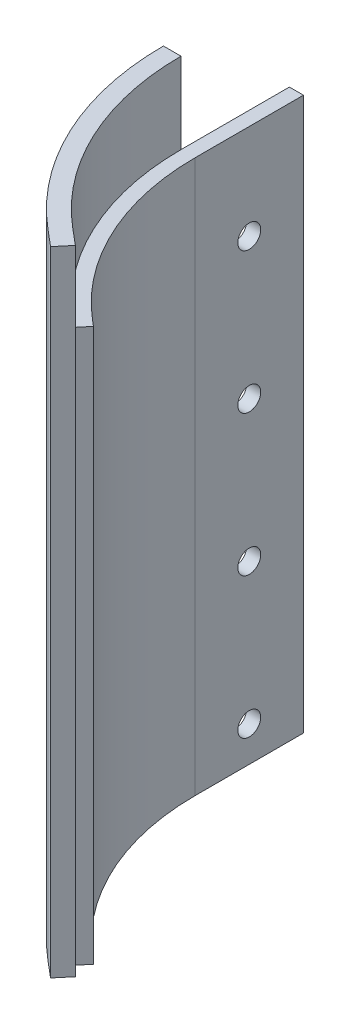
ISO-10303-21;
HEADER;
FILE_DESCRIPTION(('STEP AP214'),'2;1');
FILE_NAME('part.step','',(''),(''),'','','');
FILE_SCHEMA(('AUTOMOTIVE_DESIGN { 1 0 10303 214 1 1 1 1 }'));
ENDSEC;
DATA;
#1=APPLICATION_CONTEXT('core data for automotive mechanical design processes');
#2=APPLICATION_PROTOCOL_DEFINITION('international standard','automotive_design',2000,#1);
#3=PRODUCT_CONTEXT('',#1,'mechanical');
#4=PRODUCT('Part','Part','',(#3));
#5=PRODUCT_RELATED_PRODUCT_CATEGORY('part','',(#4));
#6=PRODUCT_DEFINITION_FORMATION('','',#4);
#7=PRODUCT_DEFINITION_CONTEXT('part definition',#1,'design');
#8=PRODUCT_DEFINITION('design','',#6,#7);
#9=PRODUCT_DEFINITION_SHAPE('','',#8);
#10=(LENGTH_UNIT() NAMED_UNIT(*) SI_UNIT(.MILLI.,.METRE.));
#11=(NAMED_UNIT(*) PLANE_ANGLE_UNIT() SI_UNIT($,.RADIAN.));
#12=(NAMED_UNIT(*) SI_UNIT($,.STERADIAN.) SOLID_ANGLE_UNIT());
#13=UNCERTAINTY_MEASURE_WITH_UNIT(LENGTH_MEASURE(1.E-05),#10,'distance_accuracy_value','');
#14=(GEOMETRIC_REPRESENTATION_CONTEXT(3) GLOBAL_UNCERTAINTY_ASSIGNED_CONTEXT((#13)) GLOBAL_UNIT_ASSIGNED_CONTEXT((#10,
#11,#12)) REPRESENTATION_CONTEXT('',''));
#15=CARTESIAN_POINT('',(0.,0.,0.));
#16=DIRECTION('',(0.,0.,1.));
#17=DIRECTION('',(1.,0.,0.));
#18=AXIS2_PLACEMENT_3D('',#15,#16,#17);
#19=CARTESIAN_POINT('',(18.3464398654779,200.,65.4116710658726));
#20=DIRECTION('',(-0.766044443118983,0.,-0.642787609686533));
#21=DIRECTION('',(0.642787609686533,0.,-0.766044443118983));
#22=AXIS2_PLACEMENT_3D('',#19,#20,#21);
#23=PLANE('',#22);
#24=DIRECTION('',(0.,-1.,0.));
#25=VECTOR('',#24,1.);
#26=CARTESIAN_POINT('',(21.5603779139106,200.,61.5814488502777));
#27=LINE('',#26,#25);
#28=CARTESIAN_POINT('',(21.5603779139106,200.,61.5814488502777));
#29=VERTEX_POINT('',#28);
#30=CARTESIAN_POINT('',(21.5603779139106,20.,61.5814488502777));
#31=VERTEX_POINT('',#30);
#32=EDGE_CURVE('E147',#29,#31,#27,.T.);
#33=ORIENTED_EDGE('',*,*,#32,.F.);
#34=DIRECTION('',(-0.642787609686533,0.,0.766044443118983));
#35=VECTOR('',#34,1.);
#36=CARTESIAN_POINT('',(18.3464398654779,200.,65.4116710658726));
#37=LINE('',#36,#35);
#38=CARTESIAN_POINT('',(18.3464398654779,200.,65.4116710658726));
#39=VERTEX_POINT('',#38);
#40=EDGE_CURVE('E217',#29,#39,#37,.T.);
#41=ORIENTED_EDGE('',*,*,#40,.T.);
#42=DIRECTION('',(0.,-1.,0.));
#43=VECTOR('',#42,1.);
#44=CARTESIAN_POINT('',(18.3464398654779,200.,65.4116710658726));
#45=LINE('',#44,#43);
#46=CARTESIAN_POINT('',(18.3464398654779,20.,65.4116710658726));
#47=VERTEX_POINT('',#46);
#48=EDGE_CURVE('E44',#39,#47,#45,.T.);
#49=ORIENTED_EDGE('',*,*,#48,.T.);
#50=DIRECTION('',(-0.642787609686533,0.,0.766044443118983));
#51=VECTOR('',#50,1.);
#52=CARTESIAN_POINT('',(18.3464398654779,20.,65.4116710658726));
#53=LINE('',#52,#51);
#54=EDGE_CURVE('E216',#31,#47,#53,.T.);
#55=ORIENTED_EDGE('',*,*,#54,.F.);
#56=EDGE_LOOP('',(#33,#41,#49,#55));
#57=FACE_BOUND('',#56,.T.);
#58=ADVANCED_FACE('F37',(#57),#23,.F.);
#59=CARTESIAN_POINT('',(18.3464398654779,200.,65.4116710658726));
#60=DIRECTION('',(0.642787609686534,0.,-0.766044443118983));
#61=DIRECTION('',(0.766044443118983,0.,0.642787609686534));
#62=AXIS2_PLACEMENT_3D('',#59,#60,#61);
#63=PLANE('',#62);
#64=DIRECTION('',(-0.766044443118983,0.,-0.642787609686534));
#65=VECTOR('',#64,1.);
#66=CARTESIAN_POINT('',(18.3464398654779,20.,65.4116710658726));
#67=LINE('',#66,#65);
#68=CARTESIAN_POINT('',(13.6735687624521,20.,61.4906666467847));
#69=VERTEX_POINT('',#68);
#70=EDGE_CURVE('E236',#47,#69,#67,.T.);
#71=ORIENTED_EDGE('',*,*,#70,.F.);
#72=ORIENTED_EDGE('',*,*,#48,.F.);
#73=DIRECTION('',(-0.766044443118983,0.,-0.642787609686534));
#74=VECTOR('',#73,1.);
#75=CARTESIAN_POINT('',(18.3464398654779,200.,65.4116710658726));
#76=LINE('',#75,#74);
#77=CARTESIAN_POINT('',(13.6735687624521,200.,61.4906666467847));
#78=VERTEX_POINT('',#77);
#79=EDGE_CURVE('E220',#39,#78,#76,.T.);
#80=ORIENTED_EDGE('',*,*,#79,.T.);
#81=DIRECTION('',(0.,-1.,0.));
#82=VECTOR('',#81,1.);
#83=CARTESIAN_POINT('',(13.6735687624521,200.,61.4906666467847));
#84=LINE('',#83,#82);
#85=EDGE_CURVE('E254',#78,#69,#84,.T.);
#86=ORIENTED_EDGE('',*,*,#85,.T.);
#87=EDGE_LOOP('',(#71,#72,#80,#86));
#88=FACE_BOUND('',#87,.T.);
#89=ADVANCED_FACE('F261',(#88),#63,.F.);
#90=CARTESIAN_POINT('',(65.2703644666136,200.,0.));
#91=DIRECTION('',(0.,-1.,0.));
#92=DIRECTION('',(0.,0.,1.));
#93=AXIS2_PLACEMENT_3D('',#90,#91,#92);
#94=CYLINDRICAL_SURFACE('',#93,80.2703644666136);
#95=CARTESIAN_POINT('',(65.2703644666136,20.,0.));
#96=DIRECTION('',(0.,-1.,0.));
#97=DIRECTION('',(0.,0.,-1.));
#98=AXIS2_PLACEMENT_3D('',#95,#96,#97);
#99=CIRCLE('',#98,80.2703644666136);
#100=CARTESIAN_POINT('',(-15.,20.,0.));
#101=VERTEX_POINT('',#100);
#102=EDGE_CURVE('E239',#69,#101,#99,.T.);
#103=ORIENTED_EDGE('',*,*,#102,.F.);
#104=ORIENTED_EDGE('',*,*,#85,.F.);
#105=CARTESIAN_POINT('',(65.2703644666136,200.,0.));
#106=DIRECTION('',(0.,-1.,0.));
#107=DIRECTION('',(0.,0.,-1.));
#108=AXIS2_PLACEMENT_3D('',#105,#106,#107);
#109=CIRCLE('',#108,80.2703644666136);
#110=CARTESIAN_POINT('',(-15.,200.,0.));
#111=VERTEX_POINT('',#110);
#112=EDGE_CURVE('E224',#78,#111,#109,.T.);
#113=ORIENTED_EDGE('',*,*,#112,.T.);
#114=DIRECTION('',(0.,-1.,0.));
#115=VECTOR('',#114,1.);
#116=CARTESIAN_POINT('',(-15.,200.,0.));
#117=LINE('',#116,#115);
#118=EDGE_CURVE('E251',#111,#101,#117,.T.);
#119=ORIENTED_EDGE('',*,*,#118,.T.);
#120=EDGE_LOOP('',(#103,#104,#113,#119));
#121=FACE_BOUND('',#120,.T.);
#122=ADVANCED_FACE('F265',(#121),#94,.T.);
#123=CARTESIAN_POINT('',(-15.,200.,0.));
#124=DIRECTION('',(0.,0.,1.));
#125=DIRECTION('',(-1.,0.,0.));
#126=AXIS2_PLACEMENT_3D('',#123,#124,#125);
#127=PLANE('',#126);
#128=DIRECTION('',(1.,0.,0.));
#129=VECTOR('',#128,1.);
#130=CARTESIAN_POINT('',(-15.,20.,0.));
#131=LINE('',#130,#129);
#132=CARTESIAN_POINT('',(-9.99999999999999,20.,0.));
#133=VERTEX_POINT('',#132);
#134=EDGE_CURVE('E221',#101,#133,#131,.T.);
#135=ORIENTED_EDGE('',*,*,#134,.F.);
#136=ORIENTED_EDGE('',*,*,#118,.F.);
#137=DIRECTION('',(1.,0.,0.));
#138=VECTOR('',#137,1.);
#139=CARTESIAN_POINT('',(-15.,200.,0.));
#140=LINE('',#139,#138);
#141=CARTESIAN_POINT('',(-9.99999999999999,200.,0.));
#142=VERTEX_POINT('',#141);
#143=EDGE_CURVE('E227',#111,#142,#140,.T.);
#144=ORIENTED_EDGE('',*,*,#143,.T.);
#145=DIRECTION('',(0.,-1.,0.));
#146=VECTOR('',#145,1.);
#147=CARTESIAN_POINT('',(-9.99999999999999,200.,0.));
#148=LINE('',#147,#146);
#149=CARTESIAN_POINT('',(-9.99999999999999,177.,0.));
#150=VERTEX_POINT('',#149);
#151=EDGE_CURVE('E248',#142,#150,#148,.T.);
#152=ORIENTED_EDGE('',*,*,#151,.T.);
#153=DIRECTION('',(0.,1.,0.));
#154=VECTOR('',#153,1.);
#155=CARTESIAN_POINT('',(-9.99999999999999,-78.4842230054058,0.));
#156=LINE('',#155,#154);
#157=EDGE_CURVE('E201',#133,#150,#156,.T.);
#158=ORIENTED_EDGE('',*,*,#157,.F.);
#159=EDGE_LOOP('',(#135,#136,#144,#152,#158));
#160=FACE_BOUND('',#159,.T.);
#161=ADVANCED_FACE('F268',(#160),#127,.F.);
#162=CARTESIAN_POINT('',(65.2703644666136,200.,0.));
#163=DIRECTION('',(0.,-1.,0.));
#164=DIRECTION('',(0.,0.,1.));
#165=AXIS2_PLACEMENT_3D('',#162,#163,#164);
#166=CYLINDRICAL_SURFACE('',#165,75.2703644666136);
#167=ORIENTED_EDGE('',*,*,#151,.F.);
#168=CARTESIAN_POINT('',(65.2703644666136,200.,0.));
#169=DIRECTION('',(0.,1.,0.));
#170=DIRECTION('',(0.,0.,-1.));
#171=AXIS2_PLACEMENT_3D('',#168,#169,#170);
#172=CIRCLE('',#171,75.2703644666136);
#173=CARTESIAN_POINT('',(16.8875068108848,200.,57.6604444311898));
#174=VERTEX_POINT('',#173);
#175=EDGE_CURVE('E230',#142,#174,#172,.T.);
#176=ORIENTED_EDGE('',*,*,#175,.T.);
#177=DIRECTION('',(0.,-1.,0.));
#178=VECTOR('',#177,1.);
#179=CARTESIAN_POINT('',(16.8875068108848,200.,57.6604444311898));
#180=LINE('',#179,#178);
#181=CARTESIAN_POINT('',(16.8875068108848,177.,57.6604444311898));
#182=VERTEX_POINT('',#181);
#183=EDGE_CURVE('E245',#174,#182,#180,.T.);
#184=ORIENTED_EDGE('',*,*,#183,.T.);
#185=CARTESIAN_POINT('',(65.2703644666136,177.,0.));
#186=DIRECTION('',(0.,-1.,0.));
#187=DIRECTION('',(0.,0.,-1.));
#188=AXIS2_PLACEMENT_3D('',#185,#186,#187);
#189=CIRCLE('',#188,75.2703644666136);
#190=EDGE_CURVE('E175',#182,#150,#189,.T.);
#191=ORIENTED_EDGE('',*,*,#190,.T.);
#192=EDGE_LOOP('',(#167,#176,#184,#191));
#193=FACE_BOUND('',#192,.T.);
#194=ADVANCED_FACE('F289',(#193),#166,.F.);
#195=CARTESIAN_POINT('',(21.5603779139106,200.,61.5814488502777));
#196=DIRECTION('',(-0.642787609686533,0.,0.766044443118983));
#197=DIRECTION('',(-0.766044443118983,0.,-0.642787609686533));
#198=AXIS2_PLACEMENT_3D('',#195,#196,#197);
#199=PLANE('',#198);
#200=DIRECTION('',(-0.766044443118983,0.,-0.642787609686533));
#201=VECTOR('',#200,1.);
#202=CARTESIAN_POINT('',(16.8875068108848,177.,57.6604444311898));
#203=LINE('',#202,#201);
#204=CARTESIAN_POINT('',(18.4962001414346,177.,59.0102984115315));
#205=VERTEX_POINT('',#204);
#206=EDGE_CURVE('E199',#205,#182,#203,.T.);
#207=ORIENTED_EDGE('',*,*,#206,.T.);
#208=ORIENTED_EDGE('',*,*,#183,.F.);
#209=DIRECTION('',(0.766044443118983,0.,0.642787609686533));
#210=VECTOR('',#209,1.);
#211=CARTESIAN_POINT('',(21.5603779139106,200.,61.5814488502777));
#212=LINE('',#211,#210);
#213=EDGE_CURVE('E233',#174,#29,#212,.T.);
#214=ORIENTED_EDGE('',*,*,#213,.T.);
#215=ORIENTED_EDGE('',*,*,#32,.T.);
#216=DIRECTION('',(-0.766044443118982,0.,-0.642787609686534));
#217=VECTOR('',#216,1.);
#218=CARTESIAN_POINT('',(21.5603779139106,20.,61.5814488502777));
#219=LINE('',#218,#217);
#220=CARTESIAN_POINT('',(18.4962001414346,20.,59.0102984115315));
#221=VERTEX_POINT('',#220);
#222=EDGE_CURVE('E132',#31,#221,#219,.T.);
#223=ORIENTED_EDGE('',*,*,#222,.T.);
#224=DIRECTION('',(0.,1.,0.));
#225=VECTOR('',#224,1.);
#226=CARTESIAN_POINT('',(18.4962001414346,20.,59.0102984115315));
#227=LINE('',#226,#225);
#228=EDGE_CURVE('E137',#221,#205,#227,.T.);
#229=ORIENTED_EDGE('',*,*,#228,.T.);
#230=EDGE_LOOP('',(#207,#208,#214,#215,#223,#229));
#231=FACE_BOUND('',#230,.T.);
#232=ADVANCED_FACE('F145',(#231),#199,.F.);
#233=CARTESIAN_POINT('',(65.2703644666136,200.,0.));
#234=DIRECTION('',(0.,1.,0.));
#235=DIRECTION('',(0.,0.,-1.));
#236=AXIS2_PLACEMENT_3D('',#233,#234,#235);
#237=PLANE('',#236);
#238=ORIENTED_EDGE('',*,*,#40,.F.);
#239=ORIENTED_EDGE('',*,*,#213,.F.);
#240=ORIENTED_EDGE('',*,*,#175,.F.);
#241=ORIENTED_EDGE('',*,*,#143,.F.);
#242=ORIENTED_EDGE('',*,*,#112,.F.);
#243=ORIENTED_EDGE('',*,*,#79,.F.);
#244=EDGE_LOOP('',(#238,#239,#240,#241,#242,#243));
#245=FACE_BOUND('',#244,.T.);
#246=ADVANCED_FACE('F291',(#245),#237,.T.);
#247=CARTESIAN_POINT('',(65.2703644666136,20.,0.));
#248=DIRECTION('',(0.,1.,0.));
#249=DIRECTION('',(0.,0.,-1.));
#250=AXIS2_PLACEMENT_3D('',#247,#248,#249);
#251=PLANE('',#250);
#252=ORIENTED_EDGE('',*,*,#54,.T.);
#253=ORIENTED_EDGE('',*,*,#70,.T.);
#254=ORIENTED_EDGE('',*,*,#102,.T.);
#255=ORIENTED_EDGE('',*,*,#134,.T.);
#256=DIRECTION('',(0.,0.,1.));
#257=VECTOR('',#256,1.);
#258=CARTESIAN_POINT('',(-9.99999999999999,20.,0.));
#259=LINE('',#258,#257);
#260=CARTESIAN_POINT('',(-9.99999999999999,20.,-30.7991819837358));
#261=VERTEX_POINT('',#260);
#262=EDGE_CURVE('E187',#261,#133,#259,.T.);
#263=ORIENTED_EDGE('',*,*,#262,.F.);
#264=DIRECTION('',(-1.,0.,0.));
#265=VECTOR('',#264,1.);
#266=CARTESIAN_POINT('',(-9.99999999999999,20.,-30.7991819837358));
#267=LINE('',#266,#265);
#268=CARTESIAN_POINT('',(-5.99999999999999,20.,-30.7991819837358));
#269=VERTEX_POINT('',#268);
#270=EDGE_CURVE('E176',#269,#261,#267,.T.);
#271=ORIENTED_EDGE('',*,*,#270,.F.);
#272=DIRECTION('',(0.,0.,-1.));
#273=VECTOR('',#272,1.);
#274=CARTESIAN_POINT('',(-5.99999999999999,20.,-30.7991819837358));
#275=LINE('',#274,#273);
#276=CARTESIAN_POINT('',(-5.99999999999999,20.,0.));
#277=VERTEX_POINT('',#276);
#278=EDGE_CURVE('E179',#277,#269,#275,.T.);
#279=ORIENTED_EDGE('',*,*,#278,.F.);
#280=CARTESIAN_POINT('',(65.2703644666136,20.,0.));
#281=DIRECTION('',(0.,-1.,0.));
#282=DIRECTION('',(0.,0.,-1.));
#283=AXIS2_PLACEMENT_3D('',#280,#281,#282);
#284=CIRCLE('',#283,71.2703644666136);
#285=CARTESIAN_POINT('',(19.4586572496309,20.,54.5962666587139));
#286=VERTEX_POINT('',#285);
#287=EDGE_CURVE('E183',#286,#277,#284,.T.);
#288=ORIENTED_EDGE('',*,*,#287,.F.);
#289=DIRECTION('',(-0.766044443118983,0.,-0.642787609686533));
#290=VECTOR('',#289,1.);
#291=CARTESIAN_POINT('',(19.4586572496309,20.,54.5962666587139));
#292=LINE('',#291,#290);
#293=CARTESIAN_POINT('',(21.0673505801808,20.,55.9461206390556));
#294=VERTEX_POINT('',#293);
#295=EDGE_CURVE('E136',#294,#286,#292,.T.);
#296=ORIENTED_EDGE('',*,*,#295,.F.);
#297=DIRECTION('',(0.642787609686534,0.,-0.766044443118983));
#298=VECTOR('',#297,1.);
#299=CARTESIAN_POINT('',(18.4962001414346,20.,59.0102984115315));
#300=LINE('',#299,#298);
#301=EDGE_CURVE('E128',#221,#294,#300,.T.);
#302=ORIENTED_EDGE('',*,*,#301,.F.);
#303=ORIENTED_EDGE('',*,*,#222,.F.);
#304=EDGE_LOOP('',(#252,#253,#254,#255,#263,#271,#279,#288,#296,#302,#303));
#305=FACE_BOUND('',#304,.T.);
#306=ADVANCED_FACE('F130',(#305),#251,.F.);
#307=CARTESIAN_POINT('',(19.4586572496309,-78.4842230054058,54.5962666587139));
#308=DIRECTION('',(0.642787609686533,0.,-0.766044443118983));
#309=DIRECTION('',(0.766044443118983,0.,0.642787609686533));
#310=AXIS2_PLACEMENT_3D('',#307,#308,#309);
#311=PLANE('',#310);
#312=DIRECTION('',(0.,1.,0.));
#313=VECTOR('',#312,1.);
#314=CARTESIAN_POINT('',(21.0673505801808,20.,55.9461206390556));
#315=LINE('',#314,#313);
#316=CARTESIAN_POINT('',(21.0673505801808,177.,55.9461206390556));
#317=VERTEX_POINT('',#316);
#318=EDGE_CURVE('E142',#294,#317,#315,.T.);
#319=ORIENTED_EDGE('',*,*,#318,.F.);
#320=ORIENTED_EDGE('',*,*,#295,.T.);
#321=DIRECTION('',(0.,1.,0.));
#322=VECTOR('',#321,1.);
#323=CARTESIAN_POINT('',(19.4586572496309,-78.4842230054058,54.5962666587139));
#324=LINE('',#323,#322);
#325=CARTESIAN_POINT('',(19.4586572496309,177.,54.5962666587139));
#326=VERTEX_POINT('',#325);
#327=EDGE_CURVE('E180',#286,#326,#324,.T.);
#328=ORIENTED_EDGE('',*,*,#327,.T.);
#329=DIRECTION('',(0.766044443118983,0.,0.642787609686533));
#330=VECTOR('',#329,1.);
#331=CARTESIAN_POINT('',(19.4586572496309,177.,54.5962666587139));
#332=LINE('',#331,#330);
#333=EDGE_CURVE('E196',#326,#317,#332,.T.);
#334=ORIENTED_EDGE('',*,*,#333,.T.);
#335=EDGE_LOOP('',(#319,#320,#328,#334));
#336=FACE_BOUND('',#335,.T.);
#337=ADVANCED_FACE('F285',(#336),#311,.T.);
#338=CARTESIAN_POINT('',(65.2703644666136,-78.4842230054058,0.));
#339=DIRECTION('',(0.,1.,0.));
#340=DIRECTION('',(0.,0.,-1.));
#341=AXIS2_PLACEMENT_3D('',#338,#339,#340);
#342=CYLINDRICAL_SURFACE('',#341,71.2703644666136);
#343=ORIENTED_EDGE('',*,*,#287,.T.);
#344=DIRECTION('',(0.,1.,0.));
#345=VECTOR('',#344,1.);
#346=CARTESIAN_POINT('',(-5.99999999999999,-78.4842230054058,0.));
#347=LINE('',#346,#345);
#348=CARTESIAN_POINT('',(-5.99999999999999,177.,0.));
#349=VERTEX_POINT('',#348);
#350=EDGE_CURVE('E204',#277,#349,#347,.T.);
#351=ORIENTED_EDGE('',*,*,#350,.T.);
#352=CARTESIAN_POINT('',(65.2703644666136,177.,0.));
#353=DIRECTION('',(0.,1.,0.));
#354=DIRECTION('',(0.,0.,-1.));
#355=AXIS2_PLACEMENT_3D('',#352,#353,#354);
#356=CIRCLE('',#355,71.2703644666136);
#357=EDGE_CURVE('E194',#349,#326,#356,.T.);
#358=ORIENTED_EDGE('',*,*,#357,.T.);
#359=ORIENTED_EDGE('',*,*,#327,.F.);
#360=EDGE_LOOP('',(#343,#351,#358,#359));
#361=FACE_BOUND('',#360,.T.);
#362=ADVANCED_FACE('F282',(#361),#342,.F.);
#363=CARTESIAN_POINT('',(-5.99999999999999,-78.4842230054058,-30.7991819837358));
#364=DIRECTION('',(1.,0.,0.));
#365=DIRECTION('',(0.,0.,1.));
#366=AXIS2_PLACEMENT_3D('',#363,#364,#365);
#367=PLANE('',#366);
#368=CARTESIAN_POINT('',(-5.99999999999999,30.,-15.3995909918679));
#369=DIRECTION('',(-1.,0.,0.));
#370=DIRECTION('',(0.,0.,1.));
#371=AXIS2_PLACEMENT_3D('',#368,#369,#370);
#372=CIRCLE('',#371,3.25);
#373=CARTESIAN_POINT('',(-5.99999999999999,30.,-12.1495909918679));
#374=VERTEX_POINT('',#373);
#375=EDGE_CURVE('E172',#374,#374,#372,.T.);
#376=ORIENTED_EDGE('',*,*,#375,.T.);
#377=EDGE_LOOP('',(#376));
#378=FACE_BOUND('',#377,.T.);
#379=CARTESIAN_POINT('',(-5.99999999999999,70.,-15.3995909918679));
#380=DIRECTION('',(-1.,0.,0.));
#381=DIRECTION('',(0.,0.,1.));
#382=AXIS2_PLACEMENT_3D('',#379,#380,#381);
#383=CIRCLE('',#382,3.25);
#384=CARTESIAN_POINT('',(-5.99999999999999,70.,-12.1495909918679));
#385=VERTEX_POINT('',#384);
#386=EDGE_CURVE('E169',#385,#385,#383,.T.);
#387=ORIENTED_EDGE('',*,*,#386,.T.);
#388=EDGE_LOOP('',(#387));
#389=FACE_BOUND('',#388,.T.);
#390=CARTESIAN_POINT('',(-5.99999999999999,110.,-15.3995909918679));
#391=DIRECTION('',(-1.,0.,0.));
#392=DIRECTION('',(0.,0.,1.));
#393=AXIS2_PLACEMENT_3D('',#390,#391,#392);
#394=CIRCLE('',#393,3.25);
#395=CARTESIAN_POINT('',(-5.99999999999999,110.,-12.1495909918679));
#396=VERTEX_POINT('',#395);
#397=EDGE_CURVE('E166',#396,#396,#394,.T.);
#398=ORIENTED_EDGE('',*,*,#397,.T.);
#399=EDGE_LOOP('',(#398));
#400=FACE_BOUND('',#399,.T.);
#401=CARTESIAN_POINT('',(-5.99999999999999,150.,-15.3995909918679));
#402=DIRECTION('',(-1.,0.,0.));
#403=DIRECTION('',(0.,0.,1.));
#404=AXIS2_PLACEMENT_3D('',#401,#402,#403);
#405=CIRCLE('',#404,3.25);
#406=CARTESIAN_POINT('',(-5.99999999999999,150.,-12.1495909918679));
#407=VERTEX_POINT('',#406);
#408=EDGE_CURVE('E155',#407,#407,#405,.T.);
#409=ORIENTED_EDGE('',*,*,#408,.T.);
#410=EDGE_LOOP('',(#409));
#411=FACE_BOUND('',#410,.T.);
#412=ORIENTED_EDGE('',*,*,#278,.T.);
#413=DIRECTION('',(0.,1.,0.));
#414=VECTOR('',#413,1.);
#415=CARTESIAN_POINT('',(-5.99999999999999,-78.4842230054058,-30.7991819837358));
#416=LINE('',#415,#414);
#417=CARTESIAN_POINT('',(-5.99999999999999,177.,-30.7991819837358));
#418=VERTEX_POINT('',#417);
#419=EDGE_CURVE('E207',#269,#418,#416,.T.);
#420=ORIENTED_EDGE('',*,*,#419,.T.);
#421=DIRECTION('',(0.,0.,1.));
#422=VECTOR('',#421,1.);
#423=CARTESIAN_POINT('',(-5.99999999999999,177.,-30.7991819837358));
#424=LINE('',#423,#422);
#425=EDGE_CURVE('E192',#418,#349,#424,.T.);
#426=ORIENTED_EDGE('',*,*,#425,.T.);
#427=ORIENTED_EDGE('',*,*,#350,.F.);
#428=EDGE_LOOP('',(#412,#420,#426,#427));
#429=FACE_BOUND('',#428,.T.);
#430=ADVANCED_FACE('F279',(#378,#389,#400,#411,#429),#367,.T.);
#431=CARTESIAN_POINT('',(-9.99999999999999,-78.4842230054058,-30.7991819837358));
#432=DIRECTION('',(0.,0.,-1.));
#433=DIRECTION('',(1.,0.,0.));
#434=AXIS2_PLACEMENT_3D('',#431,#432,#433);
#435=PLANE('',#434);
#436=ORIENTED_EDGE('',*,*,#270,.T.);
#437=DIRECTION('',(0.,1.,0.));
#438=VECTOR('',#437,1.);
#439=CARTESIAN_POINT('',(-9.99999999999999,-78.4842230054058,-30.7991819837358));
#440=LINE('',#439,#438);
#441=CARTESIAN_POINT('',(-9.99999999999999,177.,-30.7991819837358));
#442=VERTEX_POINT('',#441);
#443=EDGE_CURVE('E210',#261,#442,#440,.T.);
#444=ORIENTED_EDGE('',*,*,#443,.T.);
#445=DIRECTION('',(1.,0.,0.));
#446=VECTOR('',#445,1.);
#447=CARTESIAN_POINT('',(-9.99999999999999,177.,-30.7991819837358));
#448=LINE('',#447,#446);
#449=EDGE_CURVE('E190',#442,#418,#448,.T.);
#450=ORIENTED_EDGE('',*,*,#449,.T.);
#451=ORIENTED_EDGE('',*,*,#419,.F.);
#452=EDGE_LOOP('',(#436,#444,#450,#451));
#453=FACE_BOUND('',#452,.T.);
#454=ADVANCED_FACE('F276',(#453),#435,.T.);
#455=CARTESIAN_POINT('',(-9.99999999999999,-78.4842230054058,0.));
#456=DIRECTION('',(-1.,0.,0.));
#457=DIRECTION('',(0.,0.,-1.));
#458=AXIS2_PLACEMENT_3D('',#455,#456,#457);
#459=PLANE('',#458);
#460=CARTESIAN_POINT('',(-9.99999999999999,30.,-15.3995909918679));
#461=DIRECTION('',(1.,0.,0.));
#462=DIRECTION('',(0.,0.,-1.));
#463=AXIS2_PLACEMENT_3D('',#460,#461,#462);
#464=CIRCLE('',#463,3.25);
#465=CARTESIAN_POINT('',(-9.99999999999999,30.,-18.6495909918679));
#466=VERTEX_POINT('',#465);
#467=EDGE_CURVE('E152',#466,#466,#464,.T.);
#468=ORIENTED_EDGE('',*,*,#467,.T.);
#469=EDGE_LOOP('',(#468));
#470=FACE_BOUND('',#469,.T.);
#471=CARTESIAN_POINT('',(-9.99999999999999,70.,-15.3995909918679));
#472=DIRECTION('',(1.,0.,0.));
#473=DIRECTION('',(0.,0.,-1.));
#474=AXIS2_PLACEMENT_3D('',#471,#472,#473);
#475=CIRCLE('',#474,3.25);
#476=CARTESIAN_POINT('',(-9.99999999999999,70.,-18.6495909918679));
#477=VERTEX_POINT('',#476);
#478=EDGE_CURVE('E156',#477,#477,#475,.T.);
#479=ORIENTED_EDGE('',*,*,#478,.T.);
#480=EDGE_LOOP('',(#479));
#481=FACE_BOUND('',#480,.T.);
#482=CARTESIAN_POINT('',(-9.99999999999999,110.,-15.3995909918679));
#483=DIRECTION('',(1.,0.,0.));
#484=DIRECTION('',(0.,0.,-1.));
#485=AXIS2_PLACEMENT_3D('',#482,#483,#484);
#486=CIRCLE('',#485,3.25);
#487=CARTESIAN_POINT('',(-9.99999999999999,110.,-18.6495909918679));
#488=VERTEX_POINT('',#487);
#489=EDGE_CURVE('E159',#488,#488,#486,.T.);
#490=ORIENTED_EDGE('',*,*,#489,.T.);
#491=EDGE_LOOP('',(#490));
#492=FACE_BOUND('',#491,.T.);
#493=CARTESIAN_POINT('',(-9.99999999999999,150.,-15.3995909918679));
#494=DIRECTION('',(1.,0.,0.));
#495=DIRECTION('',(0.,0.,-1.));
#496=AXIS2_PLACEMENT_3D('',#493,#494,#495);
#497=CIRCLE('',#496,3.25);
#498=CARTESIAN_POINT('',(-9.99999999999999,150.,-18.6495909918679));
#499=VERTEX_POINT('',#498);
#500=EDGE_CURVE('E150',#499,#499,#497,.T.);
#501=ORIENTED_EDGE('',*,*,#500,.T.);
#502=EDGE_LOOP('',(#501));
#503=FACE_BOUND('',#502,.T.);
#504=ORIENTED_EDGE('',*,*,#262,.T.);
#505=ORIENTED_EDGE('',*,*,#157,.T.);
#506=DIRECTION('',(0.,0.,-1.));
#507=VECTOR('',#506,1.);
#508=CARTESIAN_POINT('',(-9.99999999999999,177.,0.));
#509=LINE('',#508,#507);
#510=EDGE_CURVE('E57',#150,#442,#509,.T.);
#511=ORIENTED_EDGE('',*,*,#510,.T.);
#512=ORIENTED_EDGE('',*,*,#443,.F.);
#513=EDGE_LOOP('',(#504,#505,#511,#512));
#514=FACE_BOUND('',#513,.T.);
#515=ADVANCED_FACE('F272',(#470,#481,#492,#503,#514),#459,.T.);
#516=CARTESIAN_POINT('',(65.2703644666136,177.,0.));
#517=DIRECTION('',(0.,1.,0.));
#518=DIRECTION('',(0.,0.,-1.));
#519=AXIS2_PLACEMENT_3D('',#516,#517,#518);
#520=PLANE('',#519);
#521=DIRECTION('',(0.642787609686534,0.,-0.766044443118983));
#522=VECTOR('',#521,1.);
#523=CARTESIAN_POINT('',(66.8790577971634,177.,1.34985398034164));
#524=LINE('',#523,#522);
#525=EDGE_CURVE('E11',#205,#317,#524,.T.);
#526=ORIENTED_EDGE('',*,*,#525,.T.);
#527=ORIENTED_EDGE('',*,*,#333,.F.);
#528=ORIENTED_EDGE('',*,*,#357,.F.);
#529=ORIENTED_EDGE('',*,*,#425,.F.);
#530=ORIENTED_EDGE('',*,*,#449,.F.);
#531=ORIENTED_EDGE('',*,*,#510,.F.);
#532=ORIENTED_EDGE('',*,*,#190,.F.);
#533=ORIENTED_EDGE('',*,*,#206,.F.);
#534=EDGE_LOOP('',(#526,#527,#528,#529,#530,#531,#532,#533));
#535=FACE_BOUND('',#534,.T.);
#536=ADVANCED_FACE('F286',(#535),#520,.T.);
#537=CARTESIAN_POINT('',(24.1315283526567,150.,-15.3995909918679));
#538=DIRECTION('',(-1.,0.,0.));
#539=DIRECTION('',(0.,0.,-1.));
#540=AXIS2_PLACEMENT_3D('',#537,#538,#539);
#541=CYLINDRICAL_SURFACE('',#540,3.25);
#542=ORIENTED_EDGE('',*,*,#408,.F.);
#543=EDGE_LOOP('',(#542));
#544=FACE_BOUND('',#543,.T.);
#545=ORIENTED_EDGE('',*,*,#500,.F.);
#546=EDGE_LOOP('',(#545));
#547=FACE_BOUND('',#546,.T.);
#548=ADVANCED_FACE('F383',(#544,#547),#541,.F.);
#549=CARTESIAN_POINT('',(24.1315283526567,110.,-15.3995909918679));
#550=DIRECTION('',(-1.,0.,0.));
#551=DIRECTION('',(0.,0.,-1.));
#552=AXIS2_PLACEMENT_3D('',#549,#550,#551);
#553=CYLINDRICAL_SURFACE('',#552,3.25);
#554=ORIENTED_EDGE('',*,*,#397,.F.);
#555=EDGE_LOOP('',(#554));
#556=FACE_BOUND('',#555,.T.);
#557=ORIENTED_EDGE('',*,*,#489,.F.);
#558=EDGE_LOOP('',(#557));
#559=FACE_BOUND('',#558,.T.);
#560=ADVANCED_FACE('F392',(#556,#559),#553,.F.);
#561=CARTESIAN_POINT('',(24.1315283526567,70.,-15.3995909918679));
#562=DIRECTION('',(-1.,0.,0.));
#563=DIRECTION('',(0.,0.,-1.));
#564=AXIS2_PLACEMENT_3D('',#561,#562,#563);
#565=CYLINDRICAL_SURFACE('',#564,3.25);
#566=ORIENTED_EDGE('',*,*,#386,.F.);
#567=EDGE_LOOP('',(#566));
#568=FACE_BOUND('',#567,.T.);
#569=ORIENTED_EDGE('',*,*,#478,.F.);
#570=EDGE_LOOP('',(#569));
#571=FACE_BOUND('',#570,.T.);
#572=ADVANCED_FACE('F402',(#568,#571),#565,.F.);
#573=CARTESIAN_POINT('',(24.1315283526567,30.,-15.3995909918679));
#574=DIRECTION('',(-1.,0.,0.));
#575=DIRECTION('',(0.,0.,-1.));
#576=AXIS2_PLACEMENT_3D('',#573,#574,#575);
#577=CYLINDRICAL_SURFACE('',#576,3.25);
#578=ORIENTED_EDGE('',*,*,#375,.F.);
#579=EDGE_LOOP('',(#578));
#580=FACE_BOUND('',#579,.T.);
#581=ORIENTED_EDGE('',*,*,#467,.F.);
#582=EDGE_LOOP('',(#581));
#583=FACE_BOUND('',#582,.T.);
#584=ADVANCED_FACE('F412',(#580,#583),#577,.F.);
#585=CARTESIAN_POINT('',(18.4962001414346,20.,59.0102984115315));
#586=DIRECTION('',(-0.766044443118983,0.,-0.642787609686534));
#587=DIRECTION('',(0.642787609686534,0.,-0.766044443118983));
#588=AXIS2_PLACEMENT_3D('',#585,#586,#587);
#589=PLANE('',#588);
#590=ORIENTED_EDGE('',*,*,#525,.F.);
#591=ORIENTED_EDGE('',*,*,#228,.F.);
#592=ORIENTED_EDGE('',*,*,#301,.T.);
#593=ORIENTED_EDGE('',*,*,#318,.T.);
#594=EDGE_LOOP('',(#590,#591,#592,#593));
#595=FACE_BOUND('',#594,.T.);
#596=ADVANCED_FACE('F139',(#595),#589,.F.);
#597=CLOSED_SHELL('',(#58,#89,#122,#161,#194,#232,#246,#306,#337,#362,#430,#454,#515,#536,#548,
#560,#572,#584,#596));
#598=MANIFOLD_SOLID_BREP('B2',#597);
#599=ADVANCED_BREP_SHAPE_REPRESENTATION('',(#18,#598),#14);
#600=SHAPE_DEFINITION_REPRESENTATION(#9,#599);
ENDSEC;
END-ISO-10303-21;
